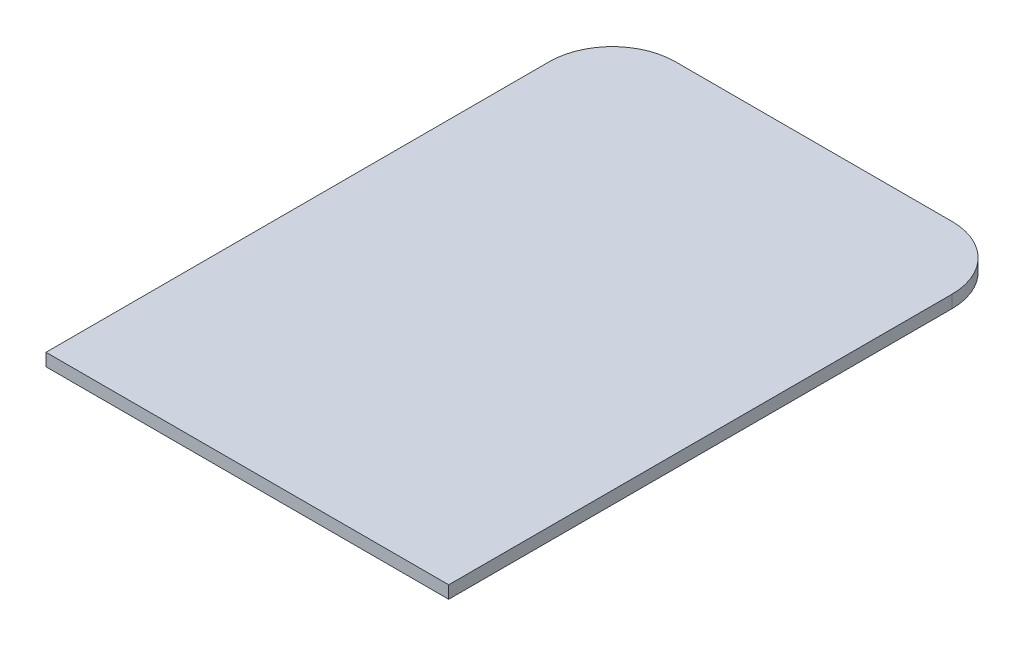
ISO-10303-21;
HEADER;
FILE_DESCRIPTION(('STEP AP214'),'2;1');
FILE_NAME('part.step','',(''),(''),'','','');
FILE_SCHEMA(('AUTOMOTIVE_DESIGN { 1 0 10303 214 1 1 1 1 }'));
ENDSEC;
DATA;
#1=APPLICATION_CONTEXT('core data for automotive mechanical design processes');
#2=APPLICATION_PROTOCOL_DEFINITION('international standard','automotive_design',2000,#1);
#3=PRODUCT_CONTEXT('',#1,'mechanical');
#4=PRODUCT('Part','Part','',(#3));
#5=PRODUCT_RELATED_PRODUCT_CATEGORY('part','',(#4));
#6=PRODUCT_DEFINITION_FORMATION('','',#4);
#7=PRODUCT_DEFINITION_CONTEXT('part definition',#1,'design');
#8=PRODUCT_DEFINITION('design','',#6,#7);
#9=PRODUCT_DEFINITION_SHAPE('','',#8);
#10=(LENGTH_UNIT() NAMED_UNIT(*) SI_UNIT(.MILLI.,.METRE.));
#11=(NAMED_UNIT(*) PLANE_ANGLE_UNIT() SI_UNIT($,.RADIAN.));
#12=(NAMED_UNIT(*) SI_UNIT($,.STERADIAN.) SOLID_ANGLE_UNIT());
#13=UNCERTAINTY_MEASURE_WITH_UNIT(LENGTH_MEASURE(1.E-05),#10,'distance_accuracy_value','');
#14=(GEOMETRIC_REPRESENTATION_CONTEXT(3) GLOBAL_UNCERTAINTY_ASSIGNED_CONTEXT((#13)) GLOBAL_UNIT_ASSIGNED_CONTEXT((#10,
#11,#12)) REPRESENTATION_CONTEXT('',''));
#15=CARTESIAN_POINT('',(0.,0.,0.));
#16=DIRECTION('',(0.,0.,1.));
#17=DIRECTION('',(1.,0.,0.));
#18=AXIS2_PLACEMENT_3D('',#15,#16,#17);
#19=CARTESIAN_POINT('',(0.,1.,0.));
#20=DIRECTION('',(0.,-1.,0.));
#21=DIRECTION('',(0.,0.,-1.));
#22=AXIS2_PLACEMENT_3D('',#19,#20,#21);
#23=PLANE('',#22);
#24=CARTESIAN_POINT('',(5.,1.,-40.));
#25=DIRECTION('',(0.,-1.,0.));
#26=DIRECTION('',(0.,0.,-1.));
#27=AXIS2_PLACEMENT_3D('',#24,#25,#26);
#28=CIRCLE('',#27,5.);
#29=CARTESIAN_POINT('',(0.,1.,-40.));
#30=VERTEX_POINT('',#29);
#31=CARTESIAN_POINT('',(5.,1.,-45.));
#32=VERTEX_POINT('',#31);
#33=EDGE_CURVE('E19',#30,#32,#28,.T.);
#34=ORIENTED_EDGE('',*,*,#33,.F.);
#35=DIRECTION('',(0.,0.,-1.));
#36=VECTOR('',#35,1.);
#37=CARTESIAN_POINT('',(0.,1.,0.));
#38=LINE('',#37,#36);
#39=CARTESIAN_POINT('',(0.,1.,0.));
#40=VERTEX_POINT('',#39);
#41=EDGE_CURVE('E83',#30,#40,#38,.F.);
#42=ORIENTED_EDGE('',*,*,#41,.T.);
#43=DIRECTION('',(-1.,0.,0.));
#44=VECTOR('',#43,1.);
#45=CARTESIAN_POINT('',(0.,1.,0.));
#46=LINE('',#45,#44);
#47=CARTESIAN_POINT('',(32.,1.,0.));
#48=VERTEX_POINT('',#47);
#49=EDGE_CURVE('E97',#40,#48,#46,.F.);
#50=ORIENTED_EDGE('',*,*,#49,.T.);
#51=DIRECTION('',(0.,0.,1.));
#52=VECTOR('',#51,1.);
#53=CARTESIAN_POINT('',(32.,1.,0.));
#54=LINE('',#53,#52);
#55=CARTESIAN_POINT('',(32.,1.,-40.));
#56=VERTEX_POINT('',#55);
#57=EDGE_CURVE('E101',#48,#56,#54,.F.);
#58=ORIENTED_EDGE('',*,*,#57,.T.);
#59=CARTESIAN_POINT('',(27.,1.,-40.));
#60=DIRECTION('',(0.,-1.,0.));
#61=DIRECTION('',(0.,0.,-1.));
#62=AXIS2_PLACEMENT_3D('',#59,#60,#61);
#63=CIRCLE('',#62,5.);
#64=CARTESIAN_POINT('',(27.,1.,-45.));
#65=VERTEX_POINT('',#64);
#66=EDGE_CURVE('E71',#65,#56,#63,.T.);
#67=ORIENTED_EDGE('',*,*,#66,.F.);
#68=DIRECTION('',(1.,0.,0.));
#69=VECTOR('',#68,1.);
#70=CARTESIAN_POINT('',(0.,1.,-45.));
#71=LINE('',#70,#69);
#72=EDGE_CURVE('E69',#65,#32,#71,.F.);
#73=ORIENTED_EDGE('',*,*,#72,.T.);
#74=EDGE_LOOP('',(#34,#42,#50,#58,#67,#73));
#75=FACE_BOUND('',#74,.T.);
#76=ADVANCED_FACE('F16',(#75),#23,.F.);
#77=CARTESIAN_POINT('',(0.,1.,0.));
#78=DIRECTION('',(1.,0.,0.));
#79=DIRECTION('',(0.,0.,-1.));
#80=AXIS2_PLACEMENT_3D('',#77,#78,#79);
#81=PLANE('',#80);
#82=DIRECTION('',(0.,-1.,0.));
#83=VECTOR('',#82,1.);
#84=CARTESIAN_POINT('',(0.,1.,-40.));
#85=LINE('',#84,#83);
#86=CARTESIAN_POINT('',(0.,0.,-40.));
#87=VERTEX_POINT('',#86);
#88=EDGE_CURVE('E76',#87,#30,#85,.F.);
#89=ORIENTED_EDGE('',*,*,#88,.F.);
#90=DIRECTION('',(0.,0.,-1.));
#91=VECTOR('',#90,1.);
#92=CARTESIAN_POINT('',(0.,0.,0.));
#93=LINE('',#92,#91);
#94=CARTESIAN_POINT('',(0.,0.,0.));
#95=VERTEX_POINT('',#94);
#96=EDGE_CURVE('E115',#95,#87,#93,.T.);
#97=ORIENTED_EDGE('',*,*,#96,.F.);
#98=DIRECTION('',(0.,1.,0.));
#99=VECTOR('',#98,1.);
#100=CARTESIAN_POINT('',(0.,1.,0.));
#101=LINE('',#100,#99);
#102=EDGE_CURVE('E94',#95,#40,#101,.T.);
#103=ORIENTED_EDGE('',*,*,#102,.T.);
#104=ORIENTED_EDGE('',*,*,#41,.F.);
#105=EDGE_LOOP('',(#89,#97,#103,#104));
#106=FACE_BOUND('',#105,.T.);
#107=ADVANCED_FACE('F153',(#106),#81,.F.);
#108=CARTESIAN_POINT('',(5.,1.,-40.));
#109=DIRECTION('',(0.,-1.,0.));
#110=DIRECTION('',(0.,0.,-1.));
#111=AXIS2_PLACEMENT_3D('',#108,#109,#110);
#112=CYLINDRICAL_SURFACE('',#111,5.);
#113=CARTESIAN_POINT('',(5.,0.,-40.));
#114=DIRECTION('',(0.,-1.,0.));
#115=DIRECTION('',(0.,0.,-1.));
#116=AXIS2_PLACEMENT_3D('',#113,#114,#115);
#117=CIRCLE('',#116,5.);
#118=CARTESIAN_POINT('',(5.,0.,-45.));
#119=VERTEX_POINT('',#118);
#120=EDGE_CURVE('E114',#87,#119,#117,.T.);
#121=ORIENTED_EDGE('',*,*,#120,.F.);
#122=ORIENTED_EDGE('',*,*,#88,.T.);
#123=ORIENTED_EDGE('',*,*,#33,.T.);
#124=DIRECTION('',(0.,1.,0.));
#125=VECTOR('',#124,1.);
#126=CARTESIAN_POINT('',(5.,1.,-45.));
#127=LINE('',#126,#125);
#128=EDGE_CURVE('E75',#32,#119,#127,.F.);
#129=ORIENTED_EDGE('',*,*,#128,.T.);
#130=EDGE_LOOP('',(#121,#122,#123,#129));
#131=FACE_BOUND('',#130,.T.);
#132=ADVANCED_FACE('F81',(#131),#112,.T.);
#133=CARTESIAN_POINT('',(0.,1.,-45.));
#134=DIRECTION('',(0.,0.,1.));
#135=DIRECTION('',(1.,0.,0.));
#136=AXIS2_PLACEMENT_3D('',#133,#134,#135);
#137=PLANE('',#136);
#138=ORIENTED_EDGE('',*,*,#128,.F.);
#139=ORIENTED_EDGE('',*,*,#72,.F.);
#140=DIRECTION('',(0.,-1.,0.));
#141=VECTOR('',#140,1.);
#142=CARTESIAN_POINT('',(27.,1.,-45.));
#143=LINE('',#142,#141);
#144=CARTESIAN_POINT('',(27.,0.,-45.));
#145=VERTEX_POINT('',#144);
#146=EDGE_CURVE('E89',#145,#65,#143,.F.);
#147=ORIENTED_EDGE('',*,*,#146,.F.);
#148=DIRECTION('',(1.,0.,0.));
#149=VECTOR('',#148,1.);
#150=CARTESIAN_POINT('',(0.,0.,-45.));
#151=LINE('',#150,#149);
#152=EDGE_CURVE('E86',#119,#145,#151,.T.);
#153=ORIENTED_EDGE('',*,*,#152,.F.);
#154=EDGE_LOOP('',(#138,#139,#147,#153));
#155=FACE_BOUND('',#154,.T.);
#156=ADVANCED_FACE('F84',(#155),#137,.F.);
#157=CARTESIAN_POINT('',(27.,1.,-40.));
#158=DIRECTION('',(0.,-1.,0.));
#159=DIRECTION('',(0.,0.,-1.));
#160=AXIS2_PLACEMENT_3D('',#157,#158,#159);
#161=CYLINDRICAL_SURFACE('',#160,5.);
#162=CARTESIAN_POINT('',(27.,0.,-40.));
#163=DIRECTION('',(0.,-1.,0.));
#164=DIRECTION('',(0.,0.,-1.));
#165=AXIS2_PLACEMENT_3D('',#162,#163,#164);
#166=CIRCLE('',#165,5.);
#167=CARTESIAN_POINT('',(32.,0.,-40.));
#168=VERTEX_POINT('',#167);
#169=EDGE_CURVE('E111',#145,#168,#166,.T.);
#170=ORIENTED_EDGE('',*,*,#169,.F.);
#171=ORIENTED_EDGE('',*,*,#146,.T.);
#172=ORIENTED_EDGE('',*,*,#66,.T.);
#173=DIRECTION('',(0.,1.,0.));
#174=VECTOR('',#173,1.);
#175=CARTESIAN_POINT('',(32.,1.,-40.));
#176=LINE('',#175,#174);
#177=EDGE_CURVE('E98',#56,#168,#176,.F.);
#178=ORIENTED_EDGE('',*,*,#177,.T.);
#179=EDGE_LOOP('',(#170,#171,#172,#178));
#180=FACE_BOUND('',#179,.T.);
#181=ADVANCED_FACE('F131',(#180),#161,.T.);
#182=CARTESIAN_POINT('',(32.,1.,0.));
#183=DIRECTION('',(-1.,0.,0.));
#184=DIRECTION('',(0.,0.,1.));
#185=AXIS2_PLACEMENT_3D('',#182,#183,#184);
#186=PLANE('',#185);
#187=ORIENTED_EDGE('',*,*,#177,.F.);
#188=ORIENTED_EDGE('',*,*,#57,.F.);
#189=DIRECTION('',(0.,1.,0.));
#190=VECTOR('',#189,1.);
#191=CARTESIAN_POINT('',(32.,1.,0.));
#192=LINE('',#191,#190);
#193=CARTESIAN_POINT('',(32.,0.,0.));
#194=VERTEX_POINT('',#193);
#195=EDGE_CURVE('E34',#48,#194,#192,.F.);
#196=ORIENTED_EDGE('',*,*,#195,.T.);
#197=DIRECTION('',(0.,0.,-1.));
#198=VECTOR('',#197,1.);
#199=CARTESIAN_POINT('',(32.,0.,0.));
#200=LINE('',#199,#198);
#201=EDGE_CURVE('E25',#168,#194,#200,.F.);
#202=ORIENTED_EDGE('',*,*,#201,.F.);
#203=EDGE_LOOP('',(#187,#188,#196,#202));
#204=FACE_BOUND('',#203,.T.);
#205=ADVANCED_FACE('F133',(#204),#186,.F.);
#206=CARTESIAN_POINT('',(0.,1.,0.));
#207=DIRECTION('',(0.,0.,-1.));
#208=DIRECTION('',(-1.,0.,0.));
#209=AXIS2_PLACEMENT_3D('',#206,#207,#208);
#210=PLANE('',#209);
#211=ORIENTED_EDGE('',*,*,#195,.F.);
#212=ORIENTED_EDGE('',*,*,#49,.F.);
#213=ORIENTED_EDGE('',*,*,#102,.F.);
#214=DIRECTION('',(1.,0.,0.));
#215=VECTOR('',#214,1.);
#216=CARTESIAN_POINT('',(0.,0.,0.));
#217=LINE('',#216,#215);
#218=EDGE_CURVE('E11',#194,#95,#217,.F.);
#219=ORIENTED_EDGE('',*,*,#218,.F.);
#220=EDGE_LOOP('',(#211,#212,#213,#219));
#221=FACE_BOUND('',#220,.T.);
#222=ADVANCED_FACE('F137',(#221),#210,.F.);
#223=CARTESIAN_POINT('',(0.,0.,0.));
#224=DIRECTION('',(0.,-1.,0.));
#225=DIRECTION('',(0.,0.,-1.));
#226=AXIS2_PLACEMENT_3D('',#223,#224,#225);
#227=PLANE('',#226);
#228=ORIENTED_EDGE('',*,*,#201,.T.);
#229=ORIENTED_EDGE('',*,*,#218,.T.);
#230=ORIENTED_EDGE('',*,*,#96,.T.);
#231=ORIENTED_EDGE('',*,*,#120,.T.);
#232=ORIENTED_EDGE('',*,*,#152,.T.);
#233=ORIENTED_EDGE('',*,*,#169,.T.);
#234=EDGE_LOOP('',(#228,#229,#230,#231,#232,#233));
#235=FACE_BOUND('',#234,.T.);
#236=ADVANCED_FACE('F135',(#235),#227,.T.);
#237=CLOSED_SHELL('',(#76,#107,#132,#156,#181,#205,#222,#236));
#238=MANIFOLD_SOLID_BREP('B1',#237);
#239=ADVANCED_BREP_SHAPE_REPRESENTATION('',(#18,#238),#14);
#240=SHAPE_DEFINITION_REPRESENTATION(#9,#239);
ENDSEC;
END-ISO-10303-21;
